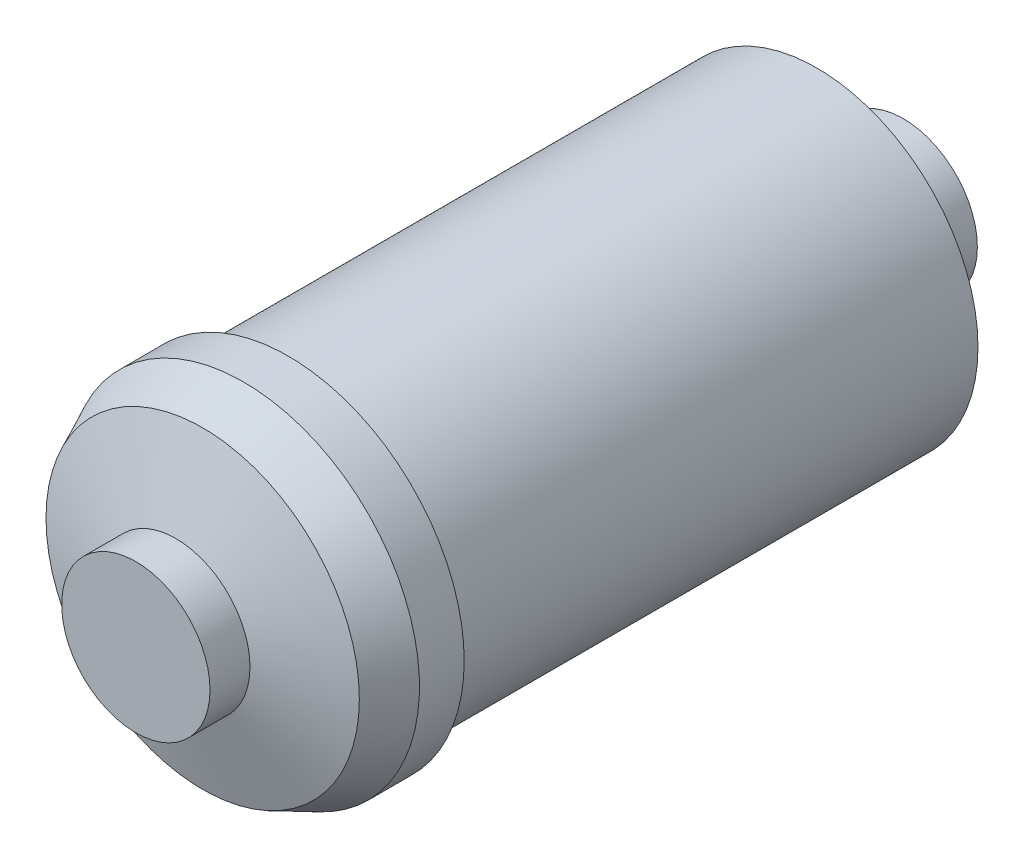
ISO-10303-21;
HEADER;
FILE_DESCRIPTION(('STEP AP214'),'2;1');
FILE_NAME('part.step','',(''),(''),'','','');
FILE_SCHEMA(('AUTOMOTIVE_DESIGN { 1 0 10303 214 1 1 1 1 }'));
ENDSEC;
DATA;
#1=APPLICATION_CONTEXT('core data for automotive mechanical design processes');
#2=APPLICATION_PROTOCOL_DEFINITION('international standard','automotive_design',2000,#1);
#3=PRODUCT_CONTEXT('',#1,'mechanical');
#4=PRODUCT('Part','Part','',(#3));
#5=PRODUCT_RELATED_PRODUCT_CATEGORY('part','',(#4));
#6=PRODUCT_DEFINITION_FORMATION('','',#4);
#7=PRODUCT_DEFINITION_CONTEXT('part definition',#1,'design');
#8=PRODUCT_DEFINITION('design','',#6,#7);
#9=PRODUCT_DEFINITION_SHAPE('','',#8);
#10=(LENGTH_UNIT() NAMED_UNIT(*) SI_UNIT(.MILLI.,.METRE.));
#11=(NAMED_UNIT(*) PLANE_ANGLE_UNIT() SI_UNIT($,.RADIAN.));
#12=(NAMED_UNIT(*) SI_UNIT($,.STERADIAN.) SOLID_ANGLE_UNIT());
#13=UNCERTAINTY_MEASURE_WITH_UNIT(LENGTH_MEASURE(1.E-05),#10,'distance_accuracy_value','');
#14=(GEOMETRIC_REPRESENTATION_CONTEXT(3) GLOBAL_UNCERTAINTY_ASSIGNED_CONTEXT((#13)) GLOBAL_UNIT_ASSIGNED_CONTEXT((#10,
#11,#12)) REPRESENTATION_CONTEXT('',''));
#15=CARTESIAN_POINT('',(0.,0.,0.));
#16=DIRECTION('',(0.,0.,1.));
#17=DIRECTION('',(1.,0.,0.));
#18=AXIS2_PLACEMENT_3D('',#15,#16,#17);
#19=CARTESIAN_POINT('',(0.,0.,8.255));
#20=DIRECTION('',(0.,0.,-1.));
#21=DIRECTION('',(-1.,0.,0.));
#22=AXIS2_PLACEMENT_3D('',#19,#20,#21);
#23=CYLINDRICAL_SURFACE('',#22,14.732);
#24=CARTESIAN_POINT('',(0.,0.,8.255));
#25=DIRECTION('',(0.,0.,1.));
#26=DIRECTION('',(1.,0.,0.));
#27=AXIS2_PLACEMENT_3D('',#24,#25,#26);
#28=CIRCLE('',#27,14.732);
#29=CARTESIAN_POINT('',(14.732,0.,8.255));
#30=VERTEX_POINT('',#29);
#31=EDGE_CURVE('E11',#30,#30,#28,.T.);
#32=ORIENTED_EDGE('',*,*,#31,.F.);
#33=EDGE_LOOP('',(#32));
#34=FACE_BOUND('',#33,.T.);
#35=CARTESIAN_POINT('',(0.,0.,0.));
#36=DIRECTION('',(0.,0.,1.));
#37=DIRECTION('',(1.,0.,0.));
#38=AXIS2_PLACEMENT_3D('',#35,#36,#37);
#39=CIRCLE('',#38,14.732);
#40=CARTESIAN_POINT('',(14.732,0.,0.));
#41=VERTEX_POINT('',#40);
#42=EDGE_CURVE('E56',#41,#41,#39,.T.);
#43=ORIENTED_EDGE('',*,*,#42,.T.);
#44=EDGE_LOOP('',(#43));
#45=FACE_BOUND('',#44,.T.);
#46=ADVANCED_FACE('F51',(#34,#45),#23,.T.);
#47=CARTESIAN_POINT('',(0.,0.,0.));
#48=DIRECTION('',(0.,0.,1.));
#49=DIRECTION('',(1.,0.,0.));
#50=AXIS2_PLACEMENT_3D('',#47,#48,#49);
#51=PLANE('',#50);
#52=ORIENTED_EDGE('',*,*,#42,.F.);
#53=EDGE_LOOP('',(#52));
#54=FACE_BOUND('',#53,.T.);
#55=ADVANCED_FACE('F98',(#54),#51,.F.);
#56=CARTESIAN_POINT('',(0.,0.,8.255));
#57=DIRECTION('',(0.,0.,1.));
#58=DIRECTION('',(1.,0.,0.));
#59=AXIS2_PLACEMENT_3D('',#56,#57,#58);
#60=CONICAL_SURFACE('',#59,14.732,1.0954533446284);
#61=ORIENTED_EDGE('',*,*,#31,.T.);
#62=EDGE_LOOP('',(#61));
#63=FACE_BOUND('',#62,.T.);
#64=CARTESIAN_POINT('',(0.,0.,17.145));
#65=DIRECTION('',(0.,0.,1.));
#66=DIRECTION('',(1.,0.,0.));
#67=AXIS2_PLACEMENT_3D('',#64,#65,#66);
#68=CIRCLE('',#67,32.004);
#69=CARTESIAN_POINT('',(32.004,0.,17.145));
#70=VERTEX_POINT('',#69);
#71=EDGE_CURVE('E67',#70,#70,#68,.T.);
#72=ORIENTED_EDGE('',*,*,#71,.F.);
#73=EDGE_LOOP('',(#72));
#74=FACE_BOUND('',#73,.T.);
#75=ADVANCED_FACE('F92',(#63,#74),#60,.T.);
#76=CARTESIAN_POINT('',(0.,0.,122.1105));
#77=DIRECTION('',(0.,0.,-1.));
#78=DIRECTION('',(-1.,0.,0.));
#79=AXIS2_PLACEMENT_3D('',#76,#77,#78);
#80=CYLINDRICAL_SURFACE('',#79,32.004);
#81=CARTESIAN_POINT('',(0.,0.,122.1105));
#82=DIRECTION('',(0.,0.,1.));
#83=DIRECTION('',(1.,0.,0.));
#84=AXIS2_PLACEMENT_3D('',#81,#82,#83);
#85=CIRCLE('',#84,32.004);
#86=CARTESIAN_POINT('',(32.004,0.,122.1105));
#87=VERTEX_POINT('',#86);
#88=EDGE_CURVE('E107',#87,#87,#85,.T.);
#89=ORIENTED_EDGE('',*,*,#88,.F.);
#90=EDGE_LOOP('',(#89));
#91=FACE_BOUND('',#90,.T.);
#92=ORIENTED_EDGE('',*,*,#71,.T.);
#93=EDGE_LOOP('',(#92));
#94=FACE_BOUND('',#93,.T.);
#95=ADVANCED_FACE('F78',(#91,#94),#80,.T.);
#96=CARTESIAN_POINT('',(0.,0.,131.0005));
#97=DIRECTION('',(0.,0.,-1.));
#98=DIRECTION('',(-1.,0.,0.));
#99=AXIS2_PLACEMENT_3D('',#96,#97,#98);
#100=CYLINDRICAL_SURFACE('',#99,34.925);
#101=CARTESIAN_POINT('',(0.,0.,131.0005));
#102=DIRECTION('',(0.,0.,-1.));
#103=DIRECTION('',(-1.,0.,0.));
#104=AXIS2_PLACEMENT_3D('',#101,#102,#103);
#105=CIRCLE('',#104,34.925);
#106=CARTESIAN_POINT('',(-34.925,0.,131.0005));
#107=VERTEX_POINT('',#106);
#108=EDGE_CURVE('E113',#107,#107,#105,.F.);
#109=ORIENTED_EDGE('',*,*,#108,.F.);
#110=EDGE_LOOP('',(#109));
#111=FACE_BOUND('',#110,.T.);
#112=CARTESIAN_POINT('',(0.,0.,122.1105));
#113=DIRECTION('',(0.,0.,1.));
#114=DIRECTION('',(1.,0.,0.));
#115=AXIS2_PLACEMENT_3D('',#112,#113,#114);
#116=CIRCLE('',#115,34.925);
#117=CARTESIAN_POINT('',(34.925,0.,122.1105));
#118=VERTEX_POINT('',#117);
#119=EDGE_CURVE('E112',#118,#118,#116,.T.);
#120=ORIENTED_EDGE('',*,*,#119,.T.);
#121=EDGE_LOOP('',(#120));
#122=FACE_BOUND('',#121,.T.);
#123=ADVANCED_FACE('F88',(#111,#122),#100,.T.);
#124=CARTESIAN_POINT('',(0.,0.,122.1105));
#125=DIRECTION('',(0.,0.,1.));
#126=DIRECTION('',(1.,0.,0.));
#127=AXIS2_PLACEMENT_3D('',#124,#125,#126);
#128=PLANE('',#127);
#129=ORIENTED_EDGE('',*,*,#88,.T.);
#130=EDGE_LOOP('',(#129));
#131=FACE_BOUND('',#130,.T.);
#132=ORIENTED_EDGE('',*,*,#119,.F.);
#133=EDGE_LOOP('',(#132));
#134=FACE_BOUND('',#133,.T.);
#135=ADVANCED_FACE('F150',(#131,#134),#128,.F.);
#136=CARTESIAN_POINT('',(0.,0.,139.1285));
#137=DIRECTION('',(0.,0.,-1.));
#138=DIRECTION('',(-1.,0.,0.));
#139=AXIS2_PLACEMENT_3D('',#136,#137,#138);
#140=CONICAL_SURFACE('',#139,31.115,0.438336559857958);
#141=ORIENTED_EDGE('',*,*,#108,.T.);
#142=EDGE_LOOP('',(#141));
#143=FACE_BOUND('',#142,.T.);
#144=CARTESIAN_POINT('',(0.,0.,139.1285));
#145=DIRECTION('',(0.,0.,1.));
#146=DIRECTION('',(1.,0.,0.));
#147=AXIS2_PLACEMENT_3D('',#144,#145,#146);
#148=CIRCLE('',#147,31.115);
#149=CARTESIAN_POINT('',(31.115,0.,139.1285));
#150=VERTEX_POINT('',#149);
#151=EDGE_CURVE('E117',#150,#150,#148,.T.);
#152=ORIENTED_EDGE('',*,*,#151,.F.);
#153=EDGE_LOOP('',(#152));
#154=FACE_BOUND('',#153,.T.);
#155=ADVANCED_FACE('F142',(#143,#154),#140,.T.);
#156=CARTESIAN_POINT('',(0.,0.,144.4625));
#157=DIRECTION('',(0.,0.,-1.));
#158=DIRECTION('',(-1.,0.,0.));
#159=AXIS2_PLACEMENT_3D('',#156,#157,#158);
#160=CONICAL_SURFACE('',#159,14.732,1.25603866540359);
#161=ORIENTED_EDGE('',*,*,#151,.T.);
#162=EDGE_LOOP('',(#161));
#163=FACE_BOUND('',#162,.T.);
#164=CARTESIAN_POINT('',(0.,0.,144.4625));
#165=DIRECTION('',(0.,0.,1.));
#166=DIRECTION('',(1.,0.,0.));
#167=AXIS2_PLACEMENT_3D('',#164,#165,#166);
#168=CIRCLE('',#167,14.732);
#169=CARTESIAN_POINT('',(14.732,0.,144.4625));
#170=VERTEX_POINT('',#169);
#171=EDGE_CURVE('E125',#170,#170,#168,.T.);
#172=ORIENTED_EDGE('',*,*,#171,.F.);
#173=EDGE_LOOP('',(#172));
#174=FACE_BOUND('',#173,.T.);
#175=ADVANCED_FACE('F137',(#163,#174),#160,.T.);
#176=CARTESIAN_POINT('',(0.,0.,152.4));
#177=DIRECTION('',(0.,0.,-1.));
#178=DIRECTION('',(-1.,0.,0.));
#179=AXIS2_PLACEMENT_3D('',#176,#177,#178);
#180=CYLINDRICAL_SURFACE('',#179,14.732);
#181=CARTESIAN_POINT('',(0.,0.,152.4));
#182=DIRECTION('',(0.,0.,1.));
#183=DIRECTION('',(1.,0.,0.));
#184=AXIS2_PLACEMENT_3D('',#181,#182,#183);
#185=CIRCLE('',#184,14.732);
#186=CARTESIAN_POINT('',(14.732,0.,152.4));
#187=VERTEX_POINT('',#186);
#188=EDGE_CURVE('E127',#187,#187,#185,.T.);
#189=ORIENTED_EDGE('',*,*,#188,.F.);
#190=EDGE_LOOP('',(#189));
#191=FACE_BOUND('',#190,.T.);
#192=ORIENTED_EDGE('',*,*,#171,.T.);
#193=EDGE_LOOP('',(#192));
#194=FACE_BOUND('',#193,.T.);
#195=ADVANCED_FACE('F135',(#191,#194),#180,.T.);
#196=CARTESIAN_POINT('',(0.,0.,152.4));
#197=DIRECTION('',(0.,0.,1.));
#198=DIRECTION('',(1.,0.,0.));
#199=AXIS2_PLACEMENT_3D('',#196,#197,#198);
#200=PLANE('',#199);
#201=ORIENTED_EDGE('',*,*,#188,.T.);
#202=EDGE_LOOP('',(#201));
#203=FACE_BOUND('',#202,.T.);
#204=ADVANCED_FACE('F132',(#203),#200,.T.);
#205=CLOSED_SHELL('',(#46,#55,#75,#95,#123,#135,#155,#175,#195,#204));
#206=MANIFOLD_SOLID_BREP('B2',#205);
#207=ADVANCED_BREP_SHAPE_REPRESENTATION('',(#18,#206),#14);
#208=SHAPE_DEFINITION_REPRESENTATION(#9,#207);
ENDSEC;
END-ISO-10303-21;
